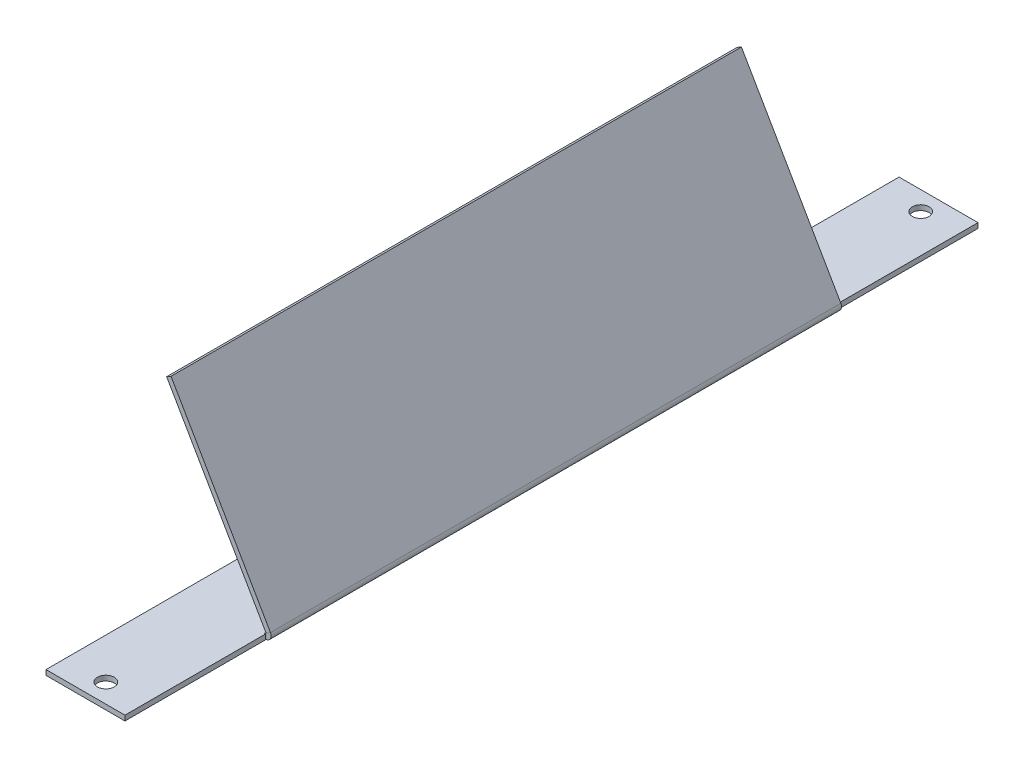
ISO-10303-21;
HEADER;
FILE_DESCRIPTION(('STEP AP214'),'2;1');
FILE_NAME('part.step','',(''),(''),'','','');
FILE_SCHEMA(('AUTOMOTIVE_DESIGN { 1 0 10303 214 1 1 1 1 }'));
ENDSEC;
DATA;
#1=APPLICATION_CONTEXT('core data for automotive mechanical design processes');
#2=APPLICATION_PROTOCOL_DEFINITION('international standard','automotive_design',2000,#1);
#3=PRODUCT_CONTEXT('',#1,'mechanical');
#4=PRODUCT('Part','Part','',(#3));
#5=PRODUCT_RELATED_PRODUCT_CATEGORY('part','',(#4));
#6=PRODUCT_DEFINITION_FORMATION('','',#4);
#7=PRODUCT_DEFINITION_CONTEXT('part definition',#1,'design');
#8=PRODUCT_DEFINITION('design','',#6,#7);
#9=PRODUCT_DEFINITION_SHAPE('','',#8);
#10=(LENGTH_UNIT() NAMED_UNIT(*) SI_UNIT(.MILLI.,.METRE.));
#11=(NAMED_UNIT(*) PLANE_ANGLE_UNIT() SI_UNIT($,.RADIAN.));
#12=(NAMED_UNIT(*) SI_UNIT($,.STERADIAN.) SOLID_ANGLE_UNIT());
#13=UNCERTAINTY_MEASURE_WITH_UNIT(LENGTH_MEASURE(1.E-05),#10,'distance_accuracy_value','');
#14=(GEOMETRIC_REPRESENTATION_CONTEXT(3) GLOBAL_UNCERTAINTY_ASSIGNED_CONTEXT((#13)) GLOBAL_UNIT_ASSIGNED_CONTEXT((#10,
#11,#12)) REPRESENTATION_CONTEXT('',''));
#15=CARTESIAN_POINT('',(0.,0.,0.));
#16=DIRECTION('',(0.,0.,1.));
#17=DIRECTION('',(1.,0.,0.));
#18=AXIS2_PLACEMENT_3D('',#15,#16,#17);
#19=CARTESIAN_POINT('',(175.,-2.,167.5));
#20=DIRECTION('',(0.,1.,0.));
#21=DIRECTION('',(0.,0.,1.));
#22=AXIS2_PLACEMENT_3D('',#19,#20,#21);
#23=PLANE('',#22);
#24=CARTESIAN_POINT('',(160.,-2.,160.));
#25=DIRECTION('',(0.,-1.,0.));
#26=DIRECTION('',(0.,0.,-1.));
#27=AXIS2_PLACEMENT_3D('',#24,#25,#26);
#28=CIRCLE('',#27,3.3);
#29=CARTESIAN_POINT('',(160.,-2.,156.7));
#30=VERTEX_POINT('',#29);
#31=EDGE_CURVE('E221',#30,#30,#28,.T.);
#32=ORIENTED_EDGE('',*,*,#31,.F.);
#33=EDGE_LOOP('',(#32));
#34=FACE_BOUND('',#33,.T.);
#35=DIRECTION('',(1.,0.,0.));
#36=VECTOR('',#35,1.);
#37=CARTESIAN_POINT('',(-175.,-2.,167.5));
#38=LINE('',#37,#36);
#39=CARTESIAN_POINT('',(144.,-2.,167.5));
#40=VERTEX_POINT('',#39);
#41=CARTESIAN_POINT('',(175.,-2.,167.5));
#42=VERTEX_POINT('',#41);
#43=EDGE_CURVE('E181',#40,#42,#38,.T.);
#44=ORIENTED_EDGE('',*,*,#43,.F.);
#45=DIRECTION('',(0.,0.,1.));
#46=VECTOR('',#45,1.);
#47=CARTESIAN_POINT('',(144.,-2.,167.5));
#48=LINE('',#47,#46);
#49=CARTESIAN_POINT('',(144.,-2.,-167.5));
#50=VERTEX_POINT('',#49);
#51=EDGE_CURVE('E168',#50,#40,#48,.T.);
#52=ORIENTED_EDGE('',*,*,#51,.F.);
#53=DIRECTION('',(-1.,0.,0.));
#54=VECTOR('',#53,1.);
#55=CARTESIAN_POINT('',(-175.,-2.,-167.5));
#56=LINE('',#55,#54);
#57=CARTESIAN_POINT('',(175.,-2.,-167.5));
#58=VERTEX_POINT('',#57);
#59=EDGE_CURVE('E179',#58,#50,#56,.T.);
#60=ORIENTED_EDGE('',*,*,#59,.F.);
#61=DIRECTION('',(0.,0.,-1.));
#62=VECTOR('',#61,1.);
#63=CARTESIAN_POINT('',(175.,-2.,-167.5));
#64=LINE('',#63,#62);
#65=CARTESIAN_POINT('',(175.,-2.,-112.3));
#66=VERTEX_POINT('',#65);
#67=EDGE_CURVE('E192',#66,#58,#64,.T.);
#68=ORIENTED_EDGE('',*,*,#67,.F.);
#69=DIRECTION('',(1.,0.,0.));
#70=VECTOR('',#69,1.);
#71=CARTESIAN_POINT('',(175.,-2.,-112.3));
#72=LINE('',#71,#70);
#73=CARTESIAN_POINT('',(174.526794919243,-2.,-112.3));
#74=VERTEX_POINT('',#73);
#75=EDGE_CURVE('E314',#74,#66,#72,.T.);
#76=ORIENTED_EDGE('',*,*,#75,.F.);
#77=DIRECTION('',(0.,0.,-1.));
#78=VECTOR('',#77,1.);
#79=CARTESIAN_POINT('',(174.526794919243,-2.,167.5));
#80=LINE('',#79,#78);
#81=CARTESIAN_POINT('',(174.526794919243,-2.,-112.));
#82=VERTEX_POINT('',#81);
#83=EDGE_CURVE('E313',#82,#74,#80,.T.);
#84=ORIENTED_EDGE('',*,*,#83,.F.);
#85=DIRECTION('',(-1.,0.,0.));
#86=VECTOR('',#85,1.);
#87=CARTESIAN_POINT('',(175.,-2.,-112.));
#88=LINE('',#87,#86);
#89=CARTESIAN_POINT('',(174.826794919243,-2.00000000000007,-112.));
#90=VERTEX_POINT('',#89);
#91=EDGE_CURVE('E311',#90,#82,#88,.T.);
#92=ORIENTED_EDGE('',*,*,#91,.F.);
#93=DIRECTION('',(0.,0.,-1.));
#94=VECTOR('',#93,1.);
#95=CARTESIAN_POINT('',(174.826794919243,-2.00000000000007,-112.));
#96=LINE('',#95,#94);
#97=CARTESIAN_POINT('',(174.826794919243,-2.,112.));
#98=VERTEX_POINT('',#97);
#99=EDGE_CURVE('E252',#90,#98,#96,.F.);
#100=ORIENTED_EDGE('',*,*,#99,.T.);
#101=DIRECTION('',(1.,0.,0.));
#102=VECTOR('',#101,1.);
#103=CARTESIAN_POINT('',(175.,-2.,112.));
#104=LINE('',#103,#102);
#105=CARTESIAN_POINT('',(174.526794919243,-2.,112.));
#106=VERTEX_POINT('',#105);
#107=EDGE_CURVE('E309',#106,#98,#104,.T.);
#108=ORIENTED_EDGE('',*,*,#107,.F.);
#109=DIRECTION('',(0.,0.,-1.));
#110=VECTOR('',#109,1.);
#111=CARTESIAN_POINT('',(174.526794919243,-2.,167.5));
#112=LINE('',#111,#110);
#113=CARTESIAN_POINT('',(174.526794919243,-2.,112.3));
#114=VERTEX_POINT('',#113);
#115=EDGE_CURVE('E307',#114,#106,#112,.T.);
#116=ORIENTED_EDGE('',*,*,#115,.F.);
#117=DIRECTION('',(-1.,0.,0.));
#118=VECTOR('',#117,1.);
#119=CARTESIAN_POINT('',(174.999999999998,-2.,112.3));
#120=LINE('',#119,#118);
#121=CARTESIAN_POINT('',(175.,-2.,112.3));
#122=VERTEX_POINT('',#121);
#123=EDGE_CURVE('E279',#122,#114,#120,.T.);
#124=ORIENTED_EDGE('',*,*,#123,.F.);
#125=EDGE_CURVE('E188',#42,#122,#64,.T.);
#126=ORIENTED_EDGE('',*,*,#125,.F.);
#127=EDGE_LOOP('',(#44,#52,#60,#68,#76,#84,#92,#100,#108,#116,#124,#126));
#128=FACE_BOUND('',#127,.T.);
#129=CARTESIAN_POINT('',(160.,-2.,-160.));
#130=DIRECTION('',(0.,-1.,0.));
#131=DIRECTION('',(0.,0.,-1.));
#132=AXIS2_PLACEMENT_3D('',#129,#130,#131);
#133=CIRCLE('',#132,3.3);
#134=CARTESIAN_POINT('',(160.,-2.,-163.3));
#135=VERTEX_POINT('',#134);
#136=EDGE_CURVE('E209',#135,#135,#133,.T.);
#137=ORIENTED_EDGE('',*,*,#136,.F.);
#138=EDGE_LOOP('',(#137));
#139=FACE_BOUND('',#138,.T.);
#140=ADVANCED_FACE('F56',(#34,#128,#139),#23,.F.);
#141=CARTESIAN_POINT('',(175.,-2.,-167.5));
#142=DIRECTION('',(1.,0.,0.));
#143=DIRECTION('',(0.,0.,-1.));
#144=AXIS2_PLACEMENT_3D('',#141,#142,#143);
#145=PLANE('',#144);
#146=DIRECTION('',(0.,0.,-1.));
#147=VECTOR('',#146,1.);
#148=CARTESIAN_POINT('',(175.,0.,-167.5));
#149=LINE('',#148,#147);
#150=CARTESIAN_POINT('',(175.,0.,-112.3));
#151=VERTEX_POINT('',#150);
#152=CARTESIAN_POINT('',(175.,0.,-167.5));
#153=VERTEX_POINT('',#152);
#154=EDGE_CURVE('E200',#151,#153,#149,.T.);
#155=ORIENTED_EDGE('',*,*,#154,.F.);
#156=DIRECTION('',(0.,-1.,0.));
#157=VECTOR('',#156,1.);
#158=CARTESIAN_POINT('',(175.,0.,-112.3));
#159=LINE('',#158,#157);
#160=EDGE_CURVE('E280',#151,#66,#159,.T.);
#161=ORIENTED_EDGE('',*,*,#160,.T.);
#162=ORIENTED_EDGE('',*,*,#67,.T.);
#163=DIRECTION('',(0.,1.,0.));
#164=VECTOR('',#163,1.);
#165=CARTESIAN_POINT('',(175.,-2.,-167.5));
#166=LINE('',#165,#164);
#167=EDGE_CURVE('E187',#58,#153,#166,.T.);
#168=ORIENTED_EDGE('',*,*,#167,.T.);
#169=EDGE_LOOP('',(#155,#161,#162,#168));
#170=FACE_BOUND('',#169,.T.);
#171=ADVANCED_FACE('F58',(#170),#145,.T.);
#172=ORIENTED_EDGE('',*,*,#125,.T.);
#173=DIRECTION('',(0.,-1.,0.));
#174=VECTOR('',#173,1.);
#175=CARTESIAN_POINT('',(175.,0.,112.3));
#176=LINE('',#175,#174);
#177=CARTESIAN_POINT('',(175.,0.,112.3));
#178=VERTEX_POINT('',#177);
#179=EDGE_CURVE('E295',#178,#122,#176,.T.);
#180=ORIENTED_EDGE('',*,*,#179,.F.);
#181=CARTESIAN_POINT('',(175.,0.,167.5));
#182=VERTEX_POINT('',#181);
#183=EDGE_CURVE('E196',#182,#178,#149,.T.);
#184=ORIENTED_EDGE('',*,*,#183,.F.);
#185=DIRECTION('',(0.,1.,0.));
#186=VECTOR('',#185,1.);
#187=CARTESIAN_POINT('',(175.,-2.,167.5));
#188=LINE('',#187,#186);
#189=EDGE_CURVE('E64',#42,#182,#188,.T.);
#190=ORIENTED_EDGE('',*,*,#189,.F.);
#191=EDGE_LOOP('',(#172,#180,#184,#190));
#192=FACE_BOUND('',#191,.T.);
#193=ADVANCED_FACE('F383',(#192),#145,.T.);
#194=CARTESIAN_POINT('',(175.,0.,167.5));
#195=DIRECTION('',(0.,1.,0.));
#196=DIRECTION('',(0.,0.,1.));
#197=AXIS2_PLACEMENT_3D('',#194,#195,#196);
#198=PLANE('',#197);
#199=DIRECTION('',(0.,0.,-1.));
#200=VECTOR('',#199,1.);
#201=CARTESIAN_POINT('',(144.,0.,167.5));
#202=LINE('',#201,#200);
#203=CARTESIAN_POINT('',(144.,0.,167.5));
#204=VERTEX_POINT('',#203);
#205=CARTESIAN_POINT('',(144.,0.,-167.5));
#206=VERTEX_POINT('',#205);
#207=EDGE_CURVE('E70',#204,#206,#202,.T.);
#208=ORIENTED_EDGE('',*,*,#207,.F.);
#209=DIRECTION('',(1.,0.,0.));
#210=VECTOR('',#209,1.);
#211=CARTESIAN_POINT('',(-175.,0.,167.5));
#212=LINE('',#211,#210);
#213=EDGE_CURVE('E202',#204,#182,#212,.T.);
#214=ORIENTED_EDGE('',*,*,#213,.T.);
#215=ORIENTED_EDGE('',*,*,#183,.T.);
#216=DIRECTION('',(1.,0.,0.));
#217=VECTOR('',#216,1.);
#218=CARTESIAN_POINT('',(174.526794919243,0.,112.3));
#219=LINE('',#218,#217);
#220=CARTESIAN_POINT('',(174.526794919243,0.,112.3));
#221=VERTEX_POINT('',#220);
#222=EDGE_CURVE('E293',#221,#178,#219,.T.);
#223=ORIENTED_EDGE('',*,*,#222,.F.);
#224=DIRECTION('',(0.,0.,1.));
#225=VECTOR('',#224,1.);
#226=CARTESIAN_POINT('',(174.526794919243,0.,112.));
#227=LINE('',#226,#225);
#228=CARTESIAN_POINT('',(174.526794919243,0.,112.));
#229=VERTEX_POINT('',#228);
#230=EDGE_CURVE('E78',#229,#221,#227,.T.);
#231=ORIENTED_EDGE('',*,*,#230,.F.);
#232=DIRECTION('',(-1.,0.,0.));
#233=VECTOR('',#232,1.);
#234=CARTESIAN_POINT('',(174.826794919243,0.,112.));
#235=LINE('',#234,#233);
#236=CARTESIAN_POINT('',(174.826794919243,0.,112.));
#237=VERTEX_POINT('',#236);
#238=EDGE_CURVE('E288',#237,#229,#235,.T.);
#239=ORIENTED_EDGE('',*,*,#238,.F.);
#240=DIRECTION('',(0.,0.,-1.));
#241=VECTOR('',#240,1.);
#242=CARTESIAN_POINT('',(174.826794919243,0.,-112.));
#243=LINE('',#242,#241);
#244=CARTESIAN_POINT('',(174.826794919243,0.,-112.));
#245=VERTEX_POINT('',#244);
#246=EDGE_CURVE('E265',#245,#237,#243,.F.);
#247=ORIENTED_EDGE('',*,*,#246,.F.);
#248=DIRECTION('',(1.,0.,0.));
#249=VECTOR('',#248,1.);
#250=CARTESIAN_POINT('',(174.526794919243,0.,-112.));
#251=LINE('',#250,#249);
#252=CARTESIAN_POINT('',(174.526794919243,0.,-112.));
#253=VERTEX_POINT('',#252);
#254=EDGE_CURVE('E285',#253,#245,#251,.T.);
#255=ORIENTED_EDGE('',*,*,#254,.F.);
#256=DIRECTION('',(0.,0.,1.));
#257=VECTOR('',#256,1.);
#258=CARTESIAN_POINT('',(174.526794919243,0.,-112.3));
#259=LINE('',#258,#257);
#260=CARTESIAN_POINT('',(174.526794919243,0.,-112.3));
#261=VERTEX_POINT('',#260);
#262=EDGE_CURVE('E281',#261,#253,#259,.T.);
#263=ORIENTED_EDGE('',*,*,#262,.F.);
#264=DIRECTION('',(-1.,0.,0.));
#265=VECTOR('',#264,1.);
#266=CARTESIAN_POINT('',(175.,0.,-112.3));
#267=LINE('',#266,#265);
#268=EDGE_CURVE('E276',#151,#261,#267,.T.);
#269=ORIENTED_EDGE('',*,*,#268,.F.);
#270=ORIENTED_EDGE('',*,*,#154,.T.);
#271=DIRECTION('',(-1.,0.,0.));
#272=VECTOR('',#271,1.);
#273=CARTESIAN_POINT('',(-175.,0.,-167.5));
#274=LINE('',#273,#272);
#275=EDGE_CURVE('E199',#153,#206,#274,.T.);
#276=ORIENTED_EDGE('',*,*,#275,.T.);
#277=EDGE_LOOP('',(#208,#214,#215,#223,#231,#239,#247,#255,#263,#269,#270,#276));
#278=FACE_BOUND('',#277,.T.);
#279=CARTESIAN_POINT('',(160.,0.,160.));
#280=DIRECTION('',(0.,1.,0.));
#281=DIRECTION('',(0.,0.,1.));
#282=AXIS2_PLACEMENT_3D('',#279,#280,#281);
#283=CIRCLE('',#282,3.3);
#284=CARTESIAN_POINT('',(160.,0.,163.3));
#285=VERTEX_POINT('',#284);
#286=EDGE_CURVE('E216',#285,#285,#283,.T.);
#287=ORIENTED_EDGE('',*,*,#286,.F.);
#288=EDGE_LOOP('',(#287));
#289=FACE_BOUND('',#288,.T.);
#290=CARTESIAN_POINT('',(160.,0.,-160.));
#291=DIRECTION('',(0.,1.,0.));
#292=DIRECTION('',(0.,0.,1.));
#293=AXIS2_PLACEMENT_3D('',#290,#291,#292);
#294=CIRCLE('',#293,3.3);
#295=CARTESIAN_POINT('',(160.,0.,-156.7));
#296=VERTEX_POINT('',#295);
#297=EDGE_CURVE('E206',#296,#296,#294,.T.);
#298=ORIENTED_EDGE('',*,*,#297,.F.);
#299=EDGE_LOOP('',(#298));
#300=FACE_BOUND('',#299,.T.);
#301=ADVANCED_FACE('F320',(#278,#289,#300),#198,.T.);
#302=CARTESIAN_POINT('',(-175.,-2.,167.5));
#303=DIRECTION('',(0.,0.,1.));
#304=DIRECTION('',(1.,0.,0.));
#305=AXIS2_PLACEMENT_3D('',#302,#303,#304);
#306=PLANE('',#305);
#307=DIRECTION('',(0.,-1.,0.));
#308=VECTOR('',#307,1.);
#309=CARTESIAN_POINT('',(144.,8.,167.5));
#310=LINE('',#309,#308);
#311=EDGE_CURVE('E182',#204,#40,#310,.T.);
#312=ORIENTED_EDGE('',*,*,#311,.T.);
#313=ORIENTED_EDGE('',*,*,#43,.T.);
#314=ORIENTED_EDGE('',*,*,#189,.T.);
#315=ORIENTED_EDGE('',*,*,#213,.F.);
#316=EDGE_LOOP('',(#312,#313,#314,#315));
#317=FACE_BOUND('',#316,.T.);
#318=ADVANCED_FACE('F390',(#317),#306,.T.);
#319=CARTESIAN_POINT('',(-175.,-2.,-167.5));
#320=DIRECTION('',(0.,0.,-1.));
#321=DIRECTION('',(-1.,0.,0.));
#322=AXIS2_PLACEMENT_3D('',#319,#320,#321);
#323=PLANE('',#322);
#324=DIRECTION('',(0.,-1.,0.));
#325=VECTOR('',#324,1.);
#326=CARTESIAN_POINT('',(144.,-2.,-167.5));
#327=LINE('',#326,#325);
#328=EDGE_CURVE('E12',#206,#50,#327,.T.);
#329=ORIENTED_EDGE('',*,*,#328,.F.);
#330=ORIENTED_EDGE('',*,*,#275,.F.);
#331=ORIENTED_EDGE('',*,*,#167,.F.);
#332=ORIENTED_EDGE('',*,*,#59,.T.);
#333=EDGE_LOOP('',(#329,#330,#331,#332));
#334=FACE_BOUND('',#333,.T.);
#335=ADVANCED_FACE('F185',(#334),#323,.T.);
#336=CARTESIAN_POINT('',(175.,0.,-112.3));
#337=DIRECTION('',(0.,0.,1.));
#338=DIRECTION('',(0.,-1.,0.));
#339=AXIS2_PLACEMENT_3D('',#336,#337,#338);
#340=PLANE('',#339);
#341=DIRECTION('',(0.,-1.,0.));
#342=VECTOR('',#341,1.);
#343=CARTESIAN_POINT('',(174.526794919243,0.,-112.3));
#344=LINE('',#343,#342);
#345=EDGE_CURVE('E284',#261,#74,#344,.T.);
#346=ORIENTED_EDGE('',*,*,#345,.T.);
#347=ORIENTED_EDGE('',*,*,#75,.T.);
#348=ORIENTED_EDGE('',*,*,#160,.F.);
#349=ORIENTED_EDGE('',*,*,#268,.T.);
#350=EDGE_LOOP('',(#346,#347,#348,#349));
#351=FACE_BOUND('',#350,.T.);
#352=ADVANCED_FACE('F327',(#351),#340,.T.);
#353=CARTESIAN_POINT('',(174.526794919243,0.,-112.3));
#354=DIRECTION('',(1.,0.,0.));
#355=DIRECTION('',(0.,0.,-1.));
#356=AXIS2_PLACEMENT_3D('',#353,#354,#355);
#357=PLANE('',#356);
#358=DIRECTION('',(0.,-1.,0.));
#359=VECTOR('',#358,1.);
#360=CARTESIAN_POINT('',(174.526794919243,0.,-112.));
#361=LINE('',#360,#359);
#362=EDGE_CURVE('E287',#253,#82,#361,.T.);
#363=ORIENTED_EDGE('',*,*,#362,.T.);
#364=ORIENTED_EDGE('',*,*,#83,.T.);
#365=ORIENTED_EDGE('',*,*,#345,.F.);
#366=ORIENTED_EDGE('',*,*,#262,.T.);
#367=EDGE_LOOP('',(#363,#364,#365,#366));
#368=FACE_BOUND('',#367,.T.);
#369=ADVANCED_FACE('F326',(#368),#357,.T.);
#370=CARTESIAN_POINT('',(174.526794919243,0.,-112.));
#371=DIRECTION('',(0.,0.,-1.));
#372=DIRECTION('',(0.,1.,0.));
#373=AXIS2_PLACEMENT_3D('',#370,#371,#372);
#374=PLANE('',#373);
#375=DIRECTION('',(-2.77555756156137E-13,-1.,0.));
#376=VECTOR('',#375,1.);
#377=CARTESIAN_POINT('',(174.826794919243,0.,-112.));
#378=LINE('',#377,#376);
#379=EDGE_CURVE('E259',#245,#90,#378,.T.);
#380=ORIENTED_EDGE('',*,*,#379,.T.);
#381=ORIENTED_EDGE('',*,*,#91,.T.);
#382=ORIENTED_EDGE('',*,*,#362,.F.);
#383=ORIENTED_EDGE('',*,*,#254,.T.);
#384=EDGE_LOOP('',(#380,#381,#382,#383));
#385=FACE_BOUND('',#384,.T.);
#386=ADVANCED_FACE('F333',(#385),#374,.T.);
#387=CARTESIAN_POINT('',(174.826794919243,0.,112.));
#388=DIRECTION('',(0.,0.,1.));
#389=DIRECTION('',(0.,-1.,0.));
#390=AXIS2_PLACEMENT_3D('',#387,#388,#389);
#391=PLANE('',#390);
#392=DIRECTION('',(0.,-1.,0.));
#393=VECTOR('',#392,1.);
#394=CARTESIAN_POINT('',(174.526794919243,0.,112.));
#395=LINE('',#394,#393);
#396=EDGE_CURVE('E292',#229,#106,#395,.T.);
#397=ORIENTED_EDGE('',*,*,#396,.T.);
#398=ORIENTED_EDGE('',*,*,#107,.T.);
#399=DIRECTION('',(-2.77555756156137E-13,-1.,0.));
#400=VECTOR('',#399,1.);
#401=CARTESIAN_POINT('',(174.826794919243,0.,112.));
#402=LINE('',#401,#400);
#403=EDGE_CURVE('E270',#237,#98,#402,.T.);
#404=ORIENTED_EDGE('',*,*,#403,.F.);
#405=ORIENTED_EDGE('',*,*,#238,.T.);
#406=EDGE_LOOP('',(#397,#398,#404,#405));
#407=FACE_BOUND('',#406,.T.);
#408=ADVANCED_FACE('F403',(#407),#391,.T.);
#409=CARTESIAN_POINT('',(174.526794919243,0.,112.));
#410=DIRECTION('',(1.,0.,0.));
#411=DIRECTION('',(0.,0.,-1.));
#412=AXIS2_PLACEMENT_3D('',#409,#410,#411);
#413=PLANE('',#412);
#414=DIRECTION('',(0.,-1.,0.));
#415=VECTOR('',#414,1.);
#416=CARTESIAN_POINT('',(174.526794919243,0.,112.3));
#417=LINE('',#416,#415);
#418=EDGE_CURVE('E273',#221,#114,#417,.T.);
#419=ORIENTED_EDGE('',*,*,#418,.T.);
#420=ORIENTED_EDGE('',*,*,#115,.T.);
#421=ORIENTED_EDGE('',*,*,#396,.F.);
#422=ORIENTED_EDGE('',*,*,#230,.T.);
#423=EDGE_LOOP('',(#419,#420,#421,#422));
#424=FACE_BOUND('',#423,.T.);
#425=ADVANCED_FACE('F408',(#424),#413,.T.);
#426=CARTESIAN_POINT('',(174.526794919243,0.,112.3));
#427=DIRECTION('',(0.,0.,-1.));
#428=DIRECTION('',(-1.,0.,0.));
#429=AXIS2_PLACEMENT_3D('',#426,#427,#428);
#430=PLANE('',#429);
#431=ORIENTED_EDGE('',*,*,#179,.T.);
#432=ORIENTED_EDGE('',*,*,#123,.T.);
#433=ORIENTED_EDGE('',*,*,#418,.F.);
#434=ORIENTED_EDGE('',*,*,#222,.T.);
#435=EDGE_LOOP('',(#431,#432,#433,#434));
#436=FACE_BOUND('',#435,.T.);
#437=ADVANCED_FACE('F412',(#436),#430,.T.);
#438=CARTESIAN_POINT('',(174.826794919243,0.0999999999999698,112.));
#439=DIRECTION('',(0.,0.,1.));
#440=DIRECTION('',(0.,-1.,0.));
#441=AXIS2_PLACEMENT_3D('',#438,#439,#440);
#442=PLANE('',#441);
#443=DIRECTION('',(0.866025403784441,0.499999999999997,0.));
#444=VECTOR('',#443,1.);
#445=CARTESIAN_POINT('',(174.913397459622,0.149999999999983,112.));
#446=LINE('',#445,#444);
#447=CARTESIAN_POINT('',(174.913397459622,0.149999999999997,112.));
#448=VERTEX_POINT('',#447);
#449=CARTESIAN_POINT('',(176.64544826719,1.15000000000007,112.));
#450=VERTEX_POINT('',#449);
#451=EDGE_CURVE('E208',#448,#450,#446,.T.);
#452=ORIENTED_EDGE('',*,*,#451,.F.);
#453=CARTESIAN_POINT('',(174.826794919243,0.0999999999999698,112.));
#454=DIRECTION('',(0.,0.,-1.));
#455=DIRECTION('',(0.,1.,0.));
#456=AXIS2_PLACEMENT_3D('',#453,#454,#455);
#457=CIRCLE('',#456,0.100000000000055);
#458=EDGE_CURVE('E262',#237,#448,#457,.F.);
#459=ORIENTED_EDGE('',*,*,#458,.F.);
#460=ORIENTED_EDGE('',*,*,#403,.T.);
#461=CARTESIAN_POINT('',(174.826794919243,0.0999999999999698,112.));
#462=DIRECTION('',(0.,0.,-1.));
#463=DIRECTION('',(0.,1.,0.));
#464=AXIS2_PLACEMENT_3D('',#461,#462,#463);
#465=CIRCLE('',#464,2.10000000000006);
#466=EDGE_CURVE('E255',#98,#450,#465,.F.);
#467=ORIENTED_EDGE('',*,*,#466,.T.);
#468=EDGE_LOOP('',(#452,#459,#460,#467));
#469=FACE_BOUND('',#468,.T.);
#470=ADVANCED_FACE('F362',(#469),#442,.T.);
#471=CARTESIAN_POINT('',(174.826794919243,0.0999999999999848,-112.));
#472=DIRECTION('',(0.,0.,1.));
#473=DIRECTION('',(0.,-1.,0.));
#474=AXIS2_PLACEMENT_3D('',#471,#472,#473);
#475=PLANE('',#474);
#476=CARTESIAN_POINT('',(174.826794919243,0.0999999999999848,-112.));
#477=DIRECTION('',(0.,0.,-1.));
#478=DIRECTION('',(0.,1.,0.));
#479=AXIS2_PLACEMENT_3D('',#476,#477,#478);
#480=CIRCLE('',#479,0.100000000000055);
#481=CARTESIAN_POINT('',(174.913397459622,0.150000000000012,-112.));
#482=VERTEX_POINT('',#481);
#483=EDGE_CURVE('E251',#482,#245,#480,.T.);
#484=ORIENTED_EDGE('',*,*,#483,.F.);
#485=DIRECTION('',(0.866025403784441,0.499999999999997,0.));
#486=VECTOR('',#485,1.);
#487=CARTESIAN_POINT('',(174.913397459622,0.149999999999983,-112.));
#488=LINE('',#487,#486);
#489=CARTESIAN_POINT('',(176.645448267191,1.15000000000004,-112.));
#490=VERTEX_POINT('',#489);
#491=EDGE_CURVE('E226',#482,#490,#488,.T.);
#492=ORIENTED_EDGE('',*,*,#491,.T.);
#493=CARTESIAN_POINT('',(174.826794919243,0.0999999999999848,-112.));
#494=DIRECTION('',(0.,0.,-1.));
#495=DIRECTION('',(0.,1.,0.));
#496=AXIS2_PLACEMENT_3D('',#493,#494,#495);
#497=CIRCLE('',#496,2.10000000000006);
#498=EDGE_CURVE('E256',#490,#90,#497,.T.);
#499=ORIENTED_EDGE('',*,*,#498,.T.);
#500=ORIENTED_EDGE('',*,*,#379,.F.);
#501=EDGE_LOOP('',(#484,#492,#499,#500));
#502=FACE_BOUND('',#501,.T.);
#503=ADVANCED_FACE('F341',(#502),#475,.F.);
#504=CARTESIAN_POINT('',(174.826794919243,0.0999999999999848,-112.));
#505=DIRECTION('',(0.,0.,-1.));
#506=DIRECTION('',(0.866025403784441,0.499999999999997,0.));
#507=AXIS2_PLACEMENT_3D('',#504,#505,#506);
#508=CYLINDRICAL_SURFACE('',#507,2.10000000000006);
#509=ORIENTED_EDGE('',*,*,#99,.F.);
#510=ORIENTED_EDGE('',*,*,#498,.F.);
#511=DIRECTION('',(0.,0.,1.));
#512=VECTOR('',#511,1.);
#513=CARTESIAN_POINT('',(176.645448267191,1.15000000000003,0.));
#514=LINE('',#513,#512);
#515=EDGE_CURVE('E228',#490,#450,#514,.T.);
#516=ORIENTED_EDGE('',*,*,#515,.T.);
#517=ORIENTED_EDGE('',*,*,#466,.F.);
#518=EDGE_LOOP('',(#509,#510,#516,#517));
#519=FACE_BOUND('',#518,.T.);
#520=ADVANCED_FACE('F339',(#519),#508,.T.);
#521=CARTESIAN_POINT('',(174.826794919243,0.0999999999999848,-112.));
#522=DIRECTION('',(0.,0.,-1.));
#523=DIRECTION('',(0.866025403784441,0.499999999999997,0.));
#524=AXIS2_PLACEMENT_3D('',#521,#522,#523);
#525=CYLINDRICAL_SURFACE('',#524,0.100000000000055);
#526=ORIENTED_EDGE('',*,*,#246,.T.);
#527=ORIENTED_EDGE('',*,*,#458,.T.);
#528=DIRECTION('',(0.,0.,-1.));
#529=VECTOR('',#528,1.);
#530=CARTESIAN_POINT('',(174.913397459622,0.149999999999983,112.));
#531=LINE('',#530,#529);
#532=EDGE_CURVE('E213',#448,#482,#531,.T.);
#533=ORIENTED_EDGE('',*,*,#532,.T.);
#534=ORIENTED_EDGE('',*,*,#483,.T.);
#535=EDGE_LOOP('',(#526,#527,#533,#534));
#536=FACE_BOUND('',#535,.T.);
#537=ADVANCED_FACE('F365',(#536),#525,.F.);
#538=CARTESIAN_POINT('',(176.732050807569,0.999999999999996,112.));
#539=DIRECTION('',(0.,0.,-1.));
#540=DIRECTION('',(-1.,0.,0.));
#541=AXIS2_PLACEMENT_3D('',#538,#539,#540);
#542=PLANE('',#541);
#543=ORIENTED_EDGE('',*,*,#451,.T.);
#544=DIRECTION('',(0.499999999999997,-0.866025403784441,0.));
#545=VECTOR('',#544,1.);
#546=CARTESIAN_POINT('',(176.732050807569,0.999999999999996,112.));
#547=LINE('',#546,#545);
#548=CARTESIAN_POINT('',(137.598076211354,68.7820323027552,112.));
#549=VERTEX_POINT('',#548);
#550=EDGE_CURVE('E232',#549,#450,#547,.T.);
#551=ORIENTED_EDGE('',*,*,#550,.F.);
#552=DIRECTION('',(-0.866025403784441,-0.499999999999996,0.));
#553=VECTOR('',#552,1.);
#554=CARTESIAN_POINT('',(137.598076211354,68.7820323027552,112.));
#555=LINE('',#554,#553);
#556=CARTESIAN_POINT('',(135.866025403785,67.7820323027552,112.));
#557=VERTEX_POINT('',#556);
#558=EDGE_CURVE('E240',#549,#557,#555,.T.);
#559=ORIENTED_EDGE('',*,*,#558,.T.);
#560=DIRECTION('',(0.499999999999997,-0.866025403784441,0.));
#561=VECTOR('',#560,1.);
#562=CARTESIAN_POINT('',(175.,0.,112.));
#563=LINE('',#562,#561);
#564=EDGE_CURVE('E231',#557,#448,#563,.T.);
#565=ORIENTED_EDGE('',*,*,#564,.T.);
#566=EDGE_LOOP('',(#543,#551,#559,#565));
#567=FACE_BOUND('',#566,.T.);
#568=ADVANCED_FACE('F359',(#567),#542,.F.);
#569=CARTESIAN_POINT('',(137.598076211354,68.7820323027552,-112.));
#570=DIRECTION('',(0.,0.,1.));
#571=DIRECTION('',(1.,0.,0.));
#572=AXIS2_PLACEMENT_3D('',#569,#570,#571);
#573=PLANE('',#572);
#574=ORIENTED_EDGE('',*,*,#491,.F.);
#575=DIRECTION('',(-0.499999999999996,0.866025403784441,0.));
#576=VECTOR('',#575,1.);
#577=CARTESIAN_POINT('',(135.866025403785,67.7820323027552,-112.));
#578=LINE('',#577,#576);
#579=CARTESIAN_POINT('',(135.866025403785,67.7820323027552,-112.));
#580=VERTEX_POINT('',#579);
#581=EDGE_CURVE('E243',#482,#580,#578,.T.);
#582=ORIENTED_EDGE('',*,*,#581,.T.);
#583=DIRECTION('',(-0.866025403784441,-0.499999999999996,0.));
#584=VECTOR('',#583,1.);
#585=CARTESIAN_POINT('',(137.598076211354,68.7820323027552,-112.));
#586=LINE('',#585,#584);
#587=CARTESIAN_POINT('',(137.598076211354,68.7820323027552,-112.));
#588=VERTEX_POINT('',#587);
#589=EDGE_CURVE('E248',#588,#580,#586,.T.);
#590=ORIENTED_EDGE('',*,*,#589,.F.);
#591=DIRECTION('',(-0.499999999999996,0.866025403784441,0.));
#592=VECTOR('',#591,1.);
#593=CARTESIAN_POINT('',(137.598076211354,68.7820323027552,-112.));
#594=LINE('',#593,#592);
#595=EDGE_CURVE('E235',#490,#588,#594,.T.);
#596=ORIENTED_EDGE('',*,*,#595,.F.);
#597=EDGE_LOOP('',(#574,#582,#590,#596));
#598=FACE_BOUND('',#597,.T.);
#599=ADVANCED_FACE('F351',(#598),#573,.F.);
#600=CARTESIAN_POINT('',(132.98205080757,76.7772228311381,0.));
#601=DIRECTION('',(-0.866025403784441,-0.499999999999997,0.));
#602=DIRECTION('',(0.499999999999997,-0.866025403784441,0.));
#603=AXIS2_PLACEMENT_3D('',#600,#601,#602);
#604=PLANE('',#603);
#605=ORIENTED_EDGE('',*,*,#515,.F.);
#606=ORIENTED_EDGE('',*,*,#595,.T.);
#607=DIRECTION('',(0.,0.,1.));
#608=VECTOR('',#607,1.);
#609=CARTESIAN_POINT('',(137.598076211354,68.7820323027552,112.));
#610=LINE('',#609,#608);
#611=EDGE_CURVE('E238',#588,#549,#610,.T.);
#612=ORIENTED_EDGE('',*,*,#611,.T.);
#613=ORIENTED_EDGE('',*,*,#550,.T.);
#614=EDGE_LOOP('',(#605,#606,#612,#613));
#615=FACE_BOUND('',#614,.T.);
#616=ADVANCED_FACE('F348',(#615),#604,.F.);
#617=CARTESIAN_POINT('',(131.250000000001,75.7772228311381,0.));
#618=DIRECTION('',(-0.866025403784441,-0.499999999999997,0.));
#619=DIRECTION('',(0.499999999999997,-0.866025403784441,0.));
#620=AXIS2_PLACEMENT_3D('',#617,#618,#619);
#621=PLANE('',#620);
#622=ORIENTED_EDGE('',*,*,#581,.F.);
#623=ORIENTED_EDGE('',*,*,#532,.F.);
#624=ORIENTED_EDGE('',*,*,#564,.F.);
#625=DIRECTION('',(0.,0.,1.));
#626=VECTOR('',#625,1.);
#627=CARTESIAN_POINT('',(135.866025403785,67.7820323027552,112.));
#628=LINE('',#627,#626);
#629=EDGE_CURVE('E236',#580,#557,#628,.T.);
#630=ORIENTED_EDGE('',*,*,#629,.F.);
#631=EDGE_LOOP('',(#622,#623,#624,#630));
#632=FACE_BOUND('',#631,.T.);
#633=ADVANCED_FACE('F367',(#632),#621,.T.);
#634=CARTESIAN_POINT('',(137.598076211354,68.7820323027552,112.));
#635=DIRECTION('',(0.499999999999996,-0.866025403784441,0.));
#636=DIRECTION('',(0.866025403784441,0.499999999999996,0.));
#637=AXIS2_PLACEMENT_3D('',#634,#635,#636);
#638=PLANE('',#637);
#639=ORIENTED_EDGE('',*,*,#629,.T.);
#640=ORIENTED_EDGE('',*,*,#558,.F.);
#641=ORIENTED_EDGE('',*,*,#611,.F.);
#642=ORIENTED_EDGE('',*,*,#589,.T.);
#643=EDGE_LOOP('',(#639,#640,#641,#642));
#644=FACE_BOUND('',#643,.T.);
#645=ADVANCED_FACE('F356',(#644),#638,.F.);
#646=CARTESIAN_POINT('',(160.,-2.,-160.));
#647=DIRECTION('',(0.,-1.,0.));
#648=DIRECTION('',(0.,0.,-1.));
#649=AXIS2_PLACEMENT_3D('',#646,#647,#648);
#650=CYLINDRICAL_SURFACE('',#649,3.3);
#651=ORIENTED_EDGE('',*,*,#297,.T.);
#652=EDGE_LOOP('',(#651));
#653=FACE_BOUND('',#652,.T.);
#654=ORIENTED_EDGE('',*,*,#136,.T.);
#655=EDGE_LOOP('',(#654));
#656=FACE_BOUND('',#655,.T.);
#657=ADVANCED_FACE('F374',(#653,#656),#650,.F.);
#658=CARTESIAN_POINT('',(160.,-2.,160.));
#659=DIRECTION('',(0.,-1.,0.));
#660=DIRECTION('',(0.,0.,-1.));
#661=AXIS2_PLACEMENT_3D('',#658,#659,#660);
#662=CYLINDRICAL_SURFACE('',#661,3.3);
#663=ORIENTED_EDGE('',*,*,#286,.T.);
#664=EDGE_LOOP('',(#663));
#665=FACE_BOUND('',#664,.T.);
#666=ORIENTED_EDGE('',*,*,#31,.T.);
#667=EDGE_LOOP('',(#666));
#668=FACE_BOUND('',#667,.T.);
#669=ADVANCED_FACE('F458',(#665,#668),#662,.F.);
#670=CARTESIAN_POINT('',(144.,8.,167.5));
#671=DIRECTION('',(1.,0.,0.));
#672=DIRECTION('',(0.,0.,-1.));
#673=AXIS2_PLACEMENT_3D('',#670,#671,#672);
#674=PLANE('',#673);
#675=ORIENTED_EDGE('',*,*,#207,.T.);
#676=ORIENTED_EDGE('',*,*,#328,.T.);
#677=ORIENTED_EDGE('',*,*,#51,.T.);
#678=ORIENTED_EDGE('',*,*,#311,.F.);
#679=EDGE_LOOP('',(#675,#676,#677,#678));
#680=FACE_BOUND('',#679,.T.);
#681=ADVANCED_FACE('F167',(#680),#674,.F.);
#682=CLOSED_SHELL('',(#140,#171,#193,#301,#318,#335,#352,#369,#386,#408,#425,#437,#470,#503,
#520,#537,#568,#599,#616,#633,#645,#657,#669,#681));
#683=MANIFOLD_SOLID_BREP('B2',#682);
#684=ADVANCED_BREP_SHAPE_REPRESENTATION('',(#18,#683),#14);
#685=SHAPE_DEFINITION_REPRESENTATION(#9,#684);
ENDSEC;
END-ISO-10303-21;
